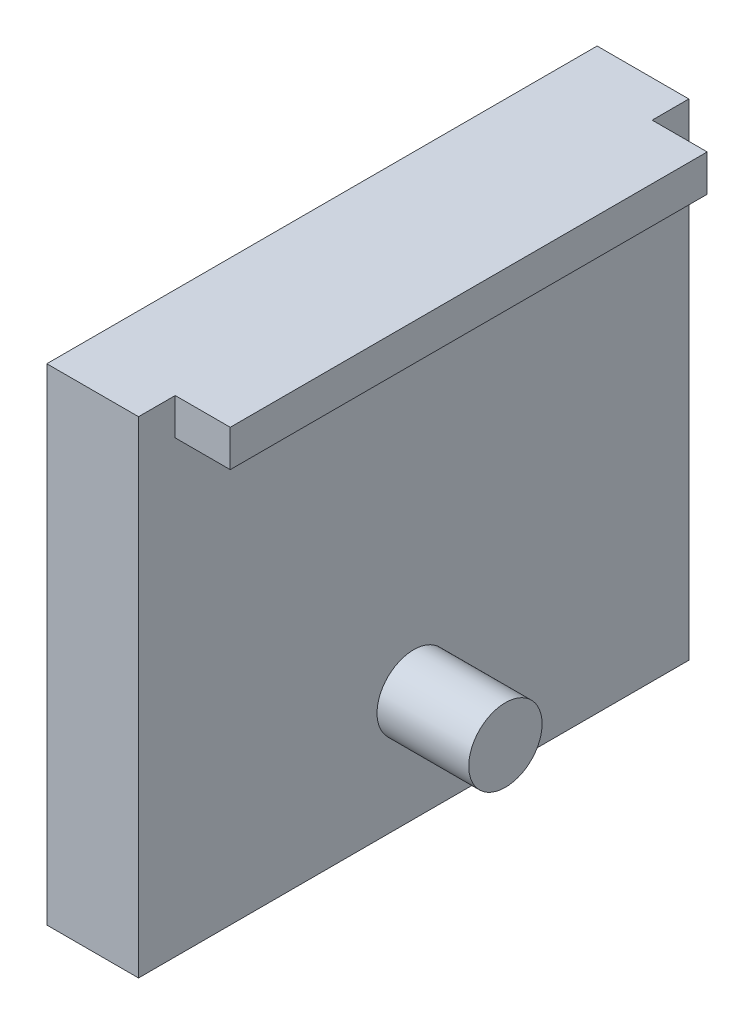
ISO-10303-21;
HEADER;
FILE_DESCRIPTION(('STEP AP214'),'2;1');
FILE_NAME('part.step','',(''),(''),'','','');
FILE_SCHEMA(('AUTOMOTIVE_DESIGN { 1 0 10303 214 1 1 1 1 }'));
ENDSEC;
DATA;
#1=APPLICATION_CONTEXT('core data for automotive mechanical design processes');
#2=APPLICATION_PROTOCOL_DEFINITION('international standard','automotive_design',2000,#1);
#3=PRODUCT_CONTEXT('',#1,'mechanical');
#4=PRODUCT('Part','Part','',(#3));
#5=PRODUCT_RELATED_PRODUCT_CATEGORY('part','',(#4));
#6=PRODUCT_DEFINITION_FORMATION('','',#4);
#7=PRODUCT_DEFINITION_CONTEXT('part definition',#1,'design');
#8=PRODUCT_DEFINITION('design','',#6,#7);
#9=PRODUCT_DEFINITION_SHAPE('','',#8);
#10=(LENGTH_UNIT() NAMED_UNIT(*) SI_UNIT(.MILLI.,.METRE.));
#11=(NAMED_UNIT(*) PLANE_ANGLE_UNIT() SI_UNIT($,.RADIAN.));
#12=(NAMED_UNIT(*) SI_UNIT($,.STERADIAN.) SOLID_ANGLE_UNIT());
#13=UNCERTAINTY_MEASURE_WITH_UNIT(LENGTH_MEASURE(1.E-05),#10,'distance_accuracy_value','');
#14=(GEOMETRIC_REPRESENTATION_CONTEXT(3) GLOBAL_UNCERTAINTY_ASSIGNED_CONTEXT((#13)) GLOBAL_UNIT_ASSIGNED_CONTEXT((#10,
#11,#12)) REPRESENTATION_CONTEXT('',''));
#15=CARTESIAN_POINT('',(0.,0.,0.));
#16=DIRECTION('',(0.,0.,1.));
#17=DIRECTION('',(1.,0.,0.));
#18=AXIS2_PLACEMENT_3D('',#15,#16,#17);
#19=CARTESIAN_POINT('',(-181.650792305083,0.,0.));
#20=DIRECTION('',(1.,0.,0.));
#21=DIRECTION('',(0.,0.,-1.));
#22=AXIS2_PLACEMENT_3D('',#19,#20,#21);
#23=PLANE('',#22);
#24=DIRECTION('',(0.,0.,1.));
#25=VECTOR('',#24,1.);
#26=CARTESIAN_POINT('',(-181.650792305083,40.,0.));
#27=LINE('',#26,#25);
#28=CARTESIAN_POINT('',(-181.650792305083,40.,138.));
#29=VERTEX_POINT('',#28);
#30=CARTESIAN_POINT('',(-181.650792305083,40.,160.));
#31=VERTEX_POINT('',#30);
#32=EDGE_CURVE('E255',#29,#31,#27,.T.);
#33=ORIENTED_EDGE('',*,*,#32,.F.);
#34=DIRECTION('',(0.,-1.,0.));
#35=VECTOR('',#34,1.);
#36=CARTESIAN_POINT('',(-181.650792305083,0.,138.));
#37=LINE('',#36,#35);
#38=CARTESIAN_POINT('',(-181.650792305083,42.,138.));
#39=VERTEX_POINT('',#38);
#40=EDGE_CURVE('E252',#39,#29,#37,.T.);
#41=ORIENTED_EDGE('',*,*,#40,.F.);
#42=DIRECTION('',(0.,0.,-1.));
#43=VECTOR('',#42,1.);
#44=CARTESIAN_POINT('',(-181.650792305083,42.,0.));
#45=LINE('',#44,#43);
#46=CARTESIAN_POINT('',(-181.650792305083,42.,160.));
#47=VERTEX_POINT('',#46);
#48=EDGE_CURVE('E249',#47,#39,#45,.T.);
#49=ORIENTED_EDGE('',*,*,#48,.F.);
#50=DIRECTION('',(0.,1.,0.));
#51=VECTOR('',#50,1.);
#52=CARTESIAN_POINT('',(-181.650792305083,0.,160.));
#53=LINE('',#52,#51);
#54=EDGE_CURVE('E246',#31,#47,#53,.T.);
#55=ORIENTED_EDGE('',*,*,#54,.F.);
#56=EDGE_LOOP('',(#33,#41,#49,#55));
#57=FACE_BOUND('',#56,.T.);
#58=DIRECTION('',(0.,0.,-1.));
#59=VECTOR('',#58,1.);
#60=CARTESIAN_POINT('',(-181.650792305083,37.,164.));
#61=LINE('',#60,#59);
#62=CARTESIAN_POINT('',(-181.650792305083,37.,164.));
#63=VERTEX_POINT('',#62);
#64=CARTESIAN_POINT('',(-181.650792305083,37.,134.));
#65=VERTEX_POINT('',#64);
#66=EDGE_CURVE('E215',#63,#65,#61,.T.);
#67=ORIENTED_EDGE('',*,*,#66,.F.);
#68=DIRECTION('',(0.,-1.,0.));
#69=VECTOR('',#68,1.);
#70=CARTESIAN_POINT('',(-181.650792305083,63.5,164.));
#71=LINE('',#70,#69);
#72=CARTESIAN_POINT('',(-181.650792305083,63.5,164.));
#73=VERTEX_POINT('',#72);
#74=EDGE_CURVE('E220',#73,#63,#71,.T.);
#75=ORIENTED_EDGE('',*,*,#74,.F.);
#76=DIRECTION('',(0.,0.,1.));
#77=VECTOR('',#76,1.);
#78=CARTESIAN_POINT('',(-181.650792305083,63.5,134.));
#79=LINE('',#78,#77);
#80=CARTESIAN_POINT('',(-181.650792305083,63.5,134.));
#81=VERTEX_POINT('',#80);
#82=EDGE_CURVE('E232',#81,#73,#79,.T.);
#83=ORIENTED_EDGE('',*,*,#82,.F.);
#84=DIRECTION('',(0.,1.,0.));
#85=VECTOR('',#84,1.);
#86=CARTESIAN_POINT('',(-181.650792305083,37.,134.));
#87=LINE('',#86,#85);
#88=EDGE_CURVE('E230',#65,#81,#87,.T.);
#89=ORIENTED_EDGE('',*,*,#88,.F.);
#90=EDGE_LOOP('',(#67,#75,#83,#89));
#91=FACE_BOUND('',#90,.T.);
#92=DIRECTION('',(0.,0.,1.));
#93=VECTOR('',#92,1.);
#94=CARTESIAN_POINT('',(-181.650792305083,44.,0.));
#95=LINE('',#94,#93);
#96=CARTESIAN_POINT('',(-181.650792305083,44.,138.));
#97=VERTEX_POINT('',#96);
#98=CARTESIAN_POINT('',(-181.650792305083,44.,160.));
#99=VERTEX_POINT('',#98);
#100=EDGE_CURVE('E11',#97,#99,#95,.T.);
#101=ORIENTED_EDGE('',*,*,#100,.F.);
#102=DIRECTION('',(0.,-1.,0.));
#103=VECTOR('',#102,1.);
#104=CARTESIAN_POINT('',(-181.650792305083,0.,138.));
#105=LINE('',#104,#103);
#106=CARTESIAN_POINT('',(-181.650792305083,46.,138.));
#107=VERTEX_POINT('',#106);
#108=EDGE_CURVE('E45',#107,#97,#105,.T.);
#109=ORIENTED_EDGE('',*,*,#108,.F.);
#110=DIRECTION('',(0.,0.,-1.));
#111=VECTOR('',#110,1.);
#112=CARTESIAN_POINT('',(-181.650792305083,46.,0.));
#113=LINE('',#112,#111);
#114=CARTESIAN_POINT('',(-181.650792305083,46.,160.));
#115=VERTEX_POINT('',#114);
#116=EDGE_CURVE('E261',#115,#107,#113,.T.);
#117=ORIENTED_EDGE('',*,*,#116,.F.);
#118=DIRECTION('',(0.,1.,0.));
#119=VECTOR('',#118,1.);
#120=CARTESIAN_POINT('',(-181.650792305083,0.,160.));
#121=LINE('',#120,#119);
#122=EDGE_CURVE('E258',#99,#115,#121,.T.);
#123=ORIENTED_EDGE('',*,*,#122,.F.);
#124=EDGE_LOOP('',(#101,#109,#117,#123));
#125=FACE_BOUND('',#124,.T.);
#126=ADVANCED_FACE('F37',(#57,#91,#125),#23,.F.);
#127=CARTESIAN_POINT('',(-176.650792305083,37.,164.));
#128=DIRECTION('',(0.,1.,0.));
#129=DIRECTION('',(0.,0.,1.));
#130=AXIS2_PLACEMENT_3D('',#127,#128,#129);
#131=PLANE('',#130);
#132=ORIENTED_EDGE('',*,*,#66,.T.);
#133=DIRECTION('',(-1.,0.,0.));
#134=VECTOR('',#133,1.);
#135=CARTESIAN_POINT('',(-176.650792305083,37.,134.));
#136=LINE('',#135,#134);
#137=CARTESIAN_POINT('',(-176.650792305083,37.,134.));
#138=VERTEX_POINT('',#137);
#139=EDGE_CURVE('E243',#138,#65,#136,.T.);
#140=ORIENTED_EDGE('',*,*,#139,.F.);
#141=DIRECTION('',(0.,0.,-1.));
#142=VECTOR('',#141,1.);
#143=CARTESIAN_POINT('',(-176.650792305083,37.,164.));
#144=LINE('',#143,#142);
#145=CARTESIAN_POINT('',(-176.650792305083,37.,164.));
#146=VERTEX_POINT('',#145);
#147=EDGE_CURVE('E216',#146,#138,#144,.T.);
#148=ORIENTED_EDGE('',*,*,#147,.F.);
#149=DIRECTION('',(-1.,0.,0.));
#150=VECTOR('',#149,1.);
#151=CARTESIAN_POINT('',(-176.650792305083,37.,164.));
#152=LINE('',#151,#150);
#153=EDGE_CURVE('E227',#146,#63,#152,.T.);
#154=ORIENTED_EDGE('',*,*,#153,.T.);
#155=EDGE_LOOP('',(#132,#140,#148,#154));
#156=FACE_BOUND('',#155,.T.);
#157=ADVANCED_FACE('F39',(#156),#131,.F.);
#158=CARTESIAN_POINT('',(-176.650792305083,37.,134.));
#159=DIRECTION('',(0.,0.,1.));
#160=DIRECTION('',(1.,0.,0.));
#161=AXIS2_PLACEMENT_3D('',#158,#159,#160);
#162=PLANE('',#161);
#163=ORIENTED_EDGE('',*,*,#88,.T.);
#164=DIRECTION('',(-1.,0.,0.));
#165=VECTOR('',#164,1.);
#166=CARTESIAN_POINT('',(-176.650792305083,63.5,134.));
#167=LINE('',#166,#165);
#168=CARTESIAN_POINT('',(-176.650792305083,63.5,134.));
#169=VERTEX_POINT('',#168);
#170=EDGE_CURVE('E240',#169,#81,#167,.T.);
#171=ORIENTED_EDGE('',*,*,#170,.F.);
#172=DIRECTION('',(0.,1.,0.));
#173=VECTOR('',#172,1.);
#174=CARTESIAN_POINT('',(-176.650792305083,37.,134.));
#175=LINE('',#174,#173);
#176=EDGE_CURVE('E219',#138,#169,#175,.T.);
#177=ORIENTED_EDGE('',*,*,#176,.F.);
#178=ORIENTED_EDGE('',*,*,#139,.T.);
#179=EDGE_LOOP('',(#163,#171,#177,#178));
#180=FACE_BOUND('',#179,.T.);
#181=ADVANCED_FACE('F297',(#180),#162,.F.);
#182=CARTESIAN_POINT('',(-176.650792305083,63.5,134.));
#183=DIRECTION('',(0.,-1.,0.));
#184=DIRECTION('',(0.,0.,-1.));
#185=AXIS2_PLACEMENT_3D('',#182,#183,#184);
#186=PLANE('',#185);
#187=ORIENTED_EDGE('',*,*,#82,.T.);
#188=DIRECTION('',(-1.,0.,0.));
#189=VECTOR('',#188,1.);
#190=CARTESIAN_POINT('',(-176.650792305083,63.5,164.));
#191=LINE('',#190,#189);
#192=CARTESIAN_POINT('',(-176.650792305083,63.5,164.));
#193=VERTEX_POINT('',#192);
#194=EDGE_CURVE('E237',#193,#73,#191,.T.);
#195=ORIENTED_EDGE('',*,*,#194,.F.);
#196=DIRECTION('',(0.,0.,1.));
#197=VECTOR('',#196,1.);
#198=CARTESIAN_POINT('',(-176.650792305083,63.5,134.));
#199=LINE('',#198,#197);
#200=CARTESIAN_POINT('',(-176.650792305083,63.5,162.));
#201=VERTEX_POINT('',#200);
#202=EDGE_CURVE('E222',#201,#193,#199,.T.);
#203=ORIENTED_EDGE('',*,*,#202,.F.);
#204=DIRECTION('',(-1.,0.,0.));
#205=VECTOR('',#204,1.);
#206=CARTESIAN_POINT('',(-173.650792305083,63.5,162.));
#207=LINE('',#206,#205);
#208=CARTESIAN_POINT('',(-173.650792305083,63.5,162.));
#209=VERTEX_POINT('',#208);
#210=EDGE_CURVE('E174',#209,#201,#207,.T.);
#211=ORIENTED_EDGE('',*,*,#210,.F.);
#212=DIRECTION('',(0.,0.,1.));
#213=VECTOR('',#212,1.);
#214=CARTESIAN_POINT('',(-173.650792305083,63.5,136.));
#215=LINE('',#214,#213);
#216=CARTESIAN_POINT('',(-173.650792305083,63.5,136.));
#217=VERTEX_POINT('',#216);
#218=EDGE_CURVE('E157',#217,#209,#215,.T.);
#219=ORIENTED_EDGE('',*,*,#218,.F.);
#220=DIRECTION('',(-1.,0.,0.));
#221=VECTOR('',#220,1.);
#222=CARTESIAN_POINT('',(-173.650792305083,63.5,136.));
#223=LINE('',#222,#221);
#224=CARTESIAN_POINT('',(-176.650792305083,63.5,136.));
#225=VERTEX_POINT('',#224);
#226=EDGE_CURVE('E154',#217,#225,#223,.T.);
#227=ORIENTED_EDGE('',*,*,#226,.T.);
#228=EDGE_CURVE('E223',#169,#225,#199,.T.);
#229=ORIENTED_EDGE('',*,*,#228,.F.);
#230=ORIENTED_EDGE('',*,*,#170,.T.);
#231=EDGE_LOOP('',(#187,#195,#203,#211,#219,#227,#229,#230));
#232=FACE_BOUND('',#231,.T.);
#233=ADVANCED_FACE('F307',(#232),#186,.F.);
#234=CARTESIAN_POINT('',(-176.650792305083,63.5,164.));
#235=DIRECTION('',(0.,0.,-1.));
#236=DIRECTION('',(-1.,0.,0.));
#237=AXIS2_PLACEMENT_3D('',#234,#235,#236);
#238=PLANE('',#237);
#239=ORIENTED_EDGE('',*,*,#74,.T.);
#240=ORIENTED_EDGE('',*,*,#153,.F.);
#241=DIRECTION('',(0.,-1.,0.));
#242=VECTOR('',#241,1.);
#243=CARTESIAN_POINT('',(-176.650792305083,63.5,164.));
#244=LINE('',#243,#242);
#245=EDGE_CURVE('E225',#193,#146,#244,.T.);
#246=ORIENTED_EDGE('',*,*,#245,.F.);
#247=ORIENTED_EDGE('',*,*,#194,.T.);
#248=EDGE_LOOP('',(#239,#240,#246,#247));
#249=FACE_BOUND('',#248,.T.);
#250=ADVANCED_FACE('F304',(#249),#238,.F.);
#251=CARTESIAN_POINT('',(-176.650792305083,0.,0.));
#252=DIRECTION('',(1.,0.,0.));
#253=DIRECTION('',(0.,0.,-1.));
#254=AXIS2_PLACEMENT_3D('',#251,#252,#253);
#255=PLANE('',#254);
#256=CARTESIAN_POINT('',(-176.650792305083,43.,149.));
#257=DIRECTION('',(1.,0.,0.));
#258=DIRECTION('',(0.,0.,-1.));
#259=AXIS2_PLACEMENT_3D('',#256,#257,#258);
#260=CIRCLE('',#259,2.);
#261=CARTESIAN_POINT('',(-176.650792305083,43.,147.));
#262=VERTEX_POINT('',#261);
#263=EDGE_CURVE('E339',#262,#262,#260,.T.);
#264=ORIENTED_EDGE('',*,*,#263,.F.);
#265=EDGE_LOOP('',(#264));
#266=FACE_BOUND('',#265,.T.);
#267=DIRECTION('',(0.,-1.,0.));
#268=VECTOR('',#267,1.);
#269=CARTESIAN_POINT('',(-176.650792305083,63.5,162.));
#270=LINE('',#269,#268);
#271=CARTESIAN_POINT('',(-176.650792305083,61.5,162.));
#272=VERTEX_POINT('',#271);
#273=EDGE_CURVE('E167',#201,#272,#270,.T.);
#274=ORIENTED_EDGE('',*,*,#273,.F.);
#275=ORIENTED_EDGE('',*,*,#202,.T.);
#276=ORIENTED_EDGE('',*,*,#245,.T.);
#277=ORIENTED_EDGE('',*,*,#147,.T.);
#278=ORIENTED_EDGE('',*,*,#176,.T.);
#279=ORIENTED_EDGE('',*,*,#228,.T.);
#280=DIRECTION('',(0.,1.,0.));
#281=VECTOR('',#280,1.);
#282=CARTESIAN_POINT('',(-176.650792305083,61.5,136.));
#283=LINE('',#282,#281);
#284=CARTESIAN_POINT('',(-176.650792305083,61.5,136.));
#285=VERTEX_POINT('',#284);
#286=EDGE_CURVE('E57',#285,#225,#283,.T.);
#287=ORIENTED_EDGE('',*,*,#286,.F.);
#288=DIRECTION('',(0.,0.,-1.));
#289=VECTOR('',#288,1.);
#290=CARTESIAN_POINT('',(-176.650792305083,61.5,162.));
#291=LINE('',#290,#289);
#292=EDGE_CURVE('E52',#272,#285,#291,.T.);
#293=ORIENTED_EDGE('',*,*,#292,.F.);
#294=EDGE_LOOP('',(#274,#275,#276,#277,#278,#279,#287,#293));
#295=FACE_BOUND('',#294,.T.);
#296=ADVANCED_FACE('F302',(#266,#295),#255,.T.);
#297=CARTESIAN_POINT('',(-181.150792305083,40.,160.));
#298=DIRECTION('',(0.,1.,0.));
#299=DIRECTION('',(0.,0.,1.));
#300=AXIS2_PLACEMENT_3D('',#297,#298,#299);
#301=PLANE('',#300);
#302=DIRECTION('',(-1.,0.,0.));
#303=VECTOR('',#302,1.);
#304=CARTESIAN_POINT('',(-181.150792305083,40.,138.));
#305=LINE('',#304,#303);
#306=CARTESIAN_POINT('',(-182.150792305083,40.,138.));
#307=VERTEX_POINT('',#306);
#308=EDGE_CURVE('E213',#29,#307,#305,.T.);
#309=ORIENTED_EDGE('',*,*,#308,.F.);
#310=ORIENTED_EDGE('',*,*,#32,.T.);
#311=DIRECTION('',(-1.,0.,0.));
#312=VECTOR('',#311,1.);
#313=CARTESIAN_POINT('',(-181.150792305083,40.,160.));
#314=LINE('',#313,#312);
#315=CARTESIAN_POINT('',(-182.150792305083,40.,160.));
#316=VERTEX_POINT('',#315);
#317=EDGE_CURVE('E207',#31,#316,#314,.T.);
#318=ORIENTED_EDGE('',*,*,#317,.T.);
#319=DIRECTION('',(0.,0.,-1.));
#320=VECTOR('',#319,1.);
#321=CARTESIAN_POINT('',(-182.150792305083,40.,160.));
#322=LINE('',#321,#320);
#323=EDGE_CURVE('E195',#316,#307,#322,.T.);
#324=ORIENTED_EDGE('',*,*,#323,.T.);
#325=EDGE_LOOP('',(#309,#310,#318,#324));
#326=FACE_BOUND('',#325,.T.);
#327=ADVANCED_FACE('F354',(#326),#301,.F.);
#328=CARTESIAN_POINT('',(-181.150792305083,40.,138.));
#329=DIRECTION('',(0.,0.,1.));
#330=DIRECTION('',(1.,0.,0.));
#331=AXIS2_PLACEMENT_3D('',#328,#329,#330);
#332=PLANE('',#331);
#333=DIRECTION('',(-1.,0.,0.));
#334=VECTOR('',#333,1.);
#335=CARTESIAN_POINT('',(-181.150792305083,42.,138.));
#336=LINE('',#335,#334);
#337=CARTESIAN_POINT('',(-182.150792305083,42.,138.));
#338=VERTEX_POINT('',#337);
#339=EDGE_CURVE('E211',#39,#338,#336,.T.);
#340=ORIENTED_EDGE('',*,*,#339,.F.);
#341=ORIENTED_EDGE('',*,*,#40,.T.);
#342=ORIENTED_EDGE('',*,*,#308,.T.);
#343=DIRECTION('',(0.,1.,0.));
#344=VECTOR('',#343,1.);
#345=CARTESIAN_POINT('',(-182.150792305083,40.,138.));
#346=LINE('',#345,#344);
#347=EDGE_CURVE('E198',#307,#338,#346,.T.);
#348=ORIENTED_EDGE('',*,*,#347,.T.);
#349=EDGE_LOOP('',(#340,#341,#342,#348));
#350=FACE_BOUND('',#349,.T.);
#351=ADVANCED_FACE('F358',(#350),#332,.F.);
#352=CARTESIAN_POINT('',(-181.150792305083,42.,138.));
#353=DIRECTION('',(0.,-1.,0.));
#354=DIRECTION('',(0.,0.,-1.));
#355=AXIS2_PLACEMENT_3D('',#352,#353,#354);
#356=PLANE('',#355);
#357=DIRECTION('',(-1.,0.,0.));
#358=VECTOR('',#357,1.);
#359=CARTESIAN_POINT('',(-181.150792305083,42.,160.));
#360=LINE('',#359,#358);
#361=CARTESIAN_POINT('',(-182.150792305083,42.,160.));
#362=VERTEX_POINT('',#361);
#363=EDGE_CURVE('E209',#47,#362,#360,.T.);
#364=ORIENTED_EDGE('',*,*,#363,.F.);
#365=ORIENTED_EDGE('',*,*,#48,.T.);
#366=ORIENTED_EDGE('',*,*,#339,.T.);
#367=DIRECTION('',(0.,0.,1.));
#368=VECTOR('',#367,1.);
#369=CARTESIAN_POINT('',(-182.150792305083,42.,138.));
#370=LINE('',#369,#368);
#371=EDGE_CURVE('E201',#338,#362,#370,.T.);
#372=ORIENTED_EDGE('',*,*,#371,.T.);
#373=EDGE_LOOP('',(#364,#365,#366,#372));
#374=FACE_BOUND('',#373,.T.);
#375=ADVANCED_FACE('F363',(#374),#356,.F.);
#376=CARTESIAN_POINT('',(-181.150792305083,42.,160.));
#377=DIRECTION('',(0.,0.,-1.));
#378=DIRECTION('',(-1.,0.,0.));
#379=AXIS2_PLACEMENT_3D('',#376,#377,#378);
#380=PLANE('',#379);
#381=ORIENTED_EDGE('',*,*,#317,.F.);
#382=ORIENTED_EDGE('',*,*,#54,.T.);
#383=ORIENTED_EDGE('',*,*,#363,.T.);
#384=DIRECTION('',(0.,-1.,0.));
#385=VECTOR('',#384,1.);
#386=CARTESIAN_POINT('',(-182.150792305083,42.,160.));
#387=LINE('',#386,#385);
#388=EDGE_CURVE('E204',#362,#316,#387,.T.);
#389=ORIENTED_EDGE('',*,*,#388,.T.);
#390=EDGE_LOOP('',(#381,#382,#383,#389));
#391=FACE_BOUND('',#390,.T.);
#392=ADVANCED_FACE('F370',(#391),#380,.F.);
#393=CARTESIAN_POINT('',(-182.150792305083,0.,0.));
#394=DIRECTION('',(1.,0.,0.));
#395=DIRECTION('',(0.,0.,-1.));
#396=AXIS2_PLACEMENT_3D('',#393,#394,#395);
#397=PLANE('',#396);
#398=ORIENTED_EDGE('',*,*,#323,.F.);
#399=ORIENTED_EDGE('',*,*,#388,.F.);
#400=ORIENTED_EDGE('',*,*,#371,.F.);
#401=ORIENTED_EDGE('',*,*,#347,.F.);
#402=EDGE_LOOP('',(#398,#399,#400,#401));
#403=FACE_BOUND('',#402,.T.);
#404=ADVANCED_FACE('F374',(#403),#397,.F.);
#405=CARTESIAN_POINT('',(-181.150792305083,44.,160.));
#406=DIRECTION('',(0.,1.,0.));
#407=DIRECTION('',(0.,0.,1.));
#408=AXIS2_PLACEMENT_3D('',#405,#406,#407);
#409=PLANE('',#408);
#410=DIRECTION('',(-1.,0.,0.));
#411=VECTOR('',#410,1.);
#412=CARTESIAN_POINT('',(-181.150792305083,44.,138.));
#413=LINE('',#412,#411);
#414=CARTESIAN_POINT('',(-182.150792305083,44.,138.));
#415=VERTEX_POINT('',#414);
#416=EDGE_CURVE('E170',#97,#415,#413,.T.);
#417=ORIENTED_EDGE('',*,*,#416,.F.);
#418=ORIENTED_EDGE('',*,*,#100,.T.);
#419=DIRECTION('',(-1.,0.,0.));
#420=VECTOR('',#419,1.);
#421=CARTESIAN_POINT('',(-181.150792305083,44.,160.));
#422=LINE('',#421,#420);
#423=CARTESIAN_POINT('',(-182.150792305083,44.,160.));
#424=VERTEX_POINT('',#423);
#425=EDGE_CURVE('E181',#99,#424,#422,.T.);
#426=ORIENTED_EDGE('',*,*,#425,.T.);
#427=DIRECTION('',(0.,0.,-1.));
#428=VECTOR('',#427,1.);
#429=CARTESIAN_POINT('',(-182.150792305083,44.,160.));
#430=LINE('',#429,#428);
#431=EDGE_CURVE('E192',#424,#415,#430,.T.);
#432=ORIENTED_EDGE('',*,*,#431,.T.);
#433=EDGE_LOOP('',(#417,#418,#426,#432));
#434=FACE_BOUND('',#433,.T.);
#435=ADVANCED_FACE('F271',(#434),#409,.F.);
#436=CARTESIAN_POINT('',(-181.150792305083,44.,138.));
#437=DIRECTION('',(0.,0.,1.));
#438=DIRECTION('',(1.,0.,0.));
#439=AXIS2_PLACEMENT_3D('',#436,#437,#438);
#440=PLANE('',#439);
#441=DIRECTION('',(-1.,0.,0.));
#442=VECTOR('',#441,1.);
#443=CARTESIAN_POINT('',(-181.150792305083,46.,138.));
#444=LINE('',#443,#442);
#445=CARTESIAN_POINT('',(-182.150792305083,46.,138.));
#446=VERTEX_POINT('',#445);
#447=EDGE_CURVE('E172',#107,#446,#444,.T.);
#448=ORIENTED_EDGE('',*,*,#447,.F.);
#449=ORIENTED_EDGE('',*,*,#108,.T.);
#450=ORIENTED_EDGE('',*,*,#416,.T.);
#451=DIRECTION('',(0.,1.,0.));
#452=VECTOR('',#451,1.);
#453=CARTESIAN_POINT('',(-182.150792305083,44.,138.));
#454=LINE('',#453,#452);
#455=EDGE_CURVE('E189',#415,#446,#454,.T.);
#456=ORIENTED_EDGE('',*,*,#455,.T.);
#457=EDGE_LOOP('',(#448,#449,#450,#456));
#458=FACE_BOUND('',#457,.T.);
#459=ADVANCED_FACE('F267',(#458),#440,.F.);
#460=CARTESIAN_POINT('',(-181.150792305083,46.,138.));
#461=DIRECTION('',(0.,-1.,0.));
#462=DIRECTION('',(0.,0.,-1.));
#463=AXIS2_PLACEMENT_3D('',#460,#461,#462);
#464=PLANE('',#463);
#465=DIRECTION('',(-1.,0.,0.));
#466=VECTOR('',#465,1.);
#467=CARTESIAN_POINT('',(-181.150792305083,46.,160.));
#468=LINE('',#467,#466);
#469=CARTESIAN_POINT('',(-182.150792305083,46.,160.));
#470=VERTEX_POINT('',#469);
#471=EDGE_CURVE('E179',#115,#470,#468,.T.);
#472=ORIENTED_EDGE('',*,*,#471,.F.);
#473=ORIENTED_EDGE('',*,*,#116,.T.);
#474=ORIENTED_EDGE('',*,*,#447,.T.);
#475=DIRECTION('',(0.,0.,1.));
#476=VECTOR('',#475,1.);
#477=CARTESIAN_POINT('',(-182.150792305083,46.,138.));
#478=LINE('',#477,#476);
#479=EDGE_CURVE('E186',#446,#470,#478,.T.);
#480=ORIENTED_EDGE('',*,*,#479,.T.);
#481=EDGE_LOOP('',(#472,#473,#474,#480));
#482=FACE_BOUND('',#481,.T.);
#483=ADVANCED_FACE('F280',(#482),#464,.F.);
#484=CARTESIAN_POINT('',(-181.150792305083,46.,160.));
#485=DIRECTION('',(0.,0.,-1.));
#486=DIRECTION('',(-1.,0.,0.));
#487=AXIS2_PLACEMENT_3D('',#484,#485,#486);
#488=PLANE('',#487);
#489=ORIENTED_EDGE('',*,*,#425,.F.);
#490=ORIENTED_EDGE('',*,*,#122,.T.);
#491=ORIENTED_EDGE('',*,*,#471,.T.);
#492=DIRECTION('',(0.,-1.,0.));
#493=VECTOR('',#492,1.);
#494=CARTESIAN_POINT('',(-182.150792305083,46.,160.));
#495=LINE('',#494,#493);
#496=EDGE_CURVE('E183',#470,#424,#495,.T.);
#497=ORIENTED_EDGE('',*,*,#496,.T.);
#498=EDGE_LOOP('',(#489,#490,#491,#497));
#499=FACE_BOUND('',#498,.T.);
#500=ADVANCED_FACE('F282',(#499),#488,.F.);
#501=CARTESIAN_POINT('',(-182.150792305083,0.,0.));
#502=DIRECTION('',(1.,0.,0.));
#503=DIRECTION('',(0.,0.,-1.));
#504=AXIS2_PLACEMENT_3D('',#501,#502,#503);
#505=PLANE('',#504);
#506=ORIENTED_EDGE('',*,*,#431,.F.);
#507=ORIENTED_EDGE('',*,*,#496,.F.);
#508=ORIENTED_EDGE('',*,*,#479,.F.);
#509=ORIENTED_EDGE('',*,*,#455,.F.);
#510=EDGE_LOOP('',(#506,#507,#508,#509));
#511=FACE_BOUND('',#510,.T.);
#512=ADVANCED_FACE('F276',(#511),#505,.F.);
#513=CARTESIAN_POINT('',(-173.650792305083,61.5,162.));
#514=DIRECTION('',(0.,1.,0.));
#515=DIRECTION('',(0.,0.,1.));
#516=AXIS2_PLACEMENT_3D('',#513,#514,#515);
#517=PLANE('',#516);
#518=ORIENTED_EDGE('',*,*,#292,.T.);
#519=DIRECTION('',(-1.,0.,0.));
#520=VECTOR('',#519,1.);
#521=CARTESIAN_POINT('',(-173.650792305083,61.5,136.));
#522=LINE('',#521,#520);
#523=CARTESIAN_POINT('',(-173.650792305083,61.5,136.));
#524=VERTEX_POINT('',#523);
#525=EDGE_CURVE('E152',#524,#285,#522,.T.);
#526=ORIENTED_EDGE('',*,*,#525,.F.);
#527=DIRECTION('',(0.,0.,-1.));
#528=VECTOR('',#527,1.);
#529=CARTESIAN_POINT('',(-173.650792305083,61.5,162.));
#530=LINE('',#529,#528);
#531=CARTESIAN_POINT('',(-173.650792305083,61.5,162.));
#532=VERTEX_POINT('',#531);
#533=EDGE_CURVE('E158',#532,#524,#530,.T.);
#534=ORIENTED_EDGE('',*,*,#533,.F.);
#535=DIRECTION('',(-1.,0.,0.));
#536=VECTOR('',#535,1.);
#537=CARTESIAN_POINT('',(-173.650792305083,61.5,162.));
#538=LINE('',#537,#536);
#539=EDGE_CURVE('E330',#532,#272,#538,.T.);
#540=ORIENTED_EDGE('',*,*,#539,.T.);
#541=EDGE_LOOP('',(#518,#526,#534,#540));
#542=FACE_BOUND('',#541,.T.);
#543=ADVANCED_FACE('F169',(#542),#517,.F.);
#544=CARTESIAN_POINT('',(-173.650792305083,61.5,136.));
#545=DIRECTION('',(0.,0.,1.));
#546=DIRECTION('',(1.,0.,0.));
#547=AXIS2_PLACEMENT_3D('',#544,#545,#546);
#548=PLANE('',#547);
#549=ORIENTED_EDGE('',*,*,#286,.T.);
#550=ORIENTED_EDGE('',*,*,#226,.F.);
#551=DIRECTION('',(0.,1.,0.));
#552=VECTOR('',#551,1.);
#553=CARTESIAN_POINT('',(-173.650792305083,61.5,136.));
#554=LINE('',#553,#552);
#555=EDGE_CURVE('E148',#524,#217,#554,.T.);
#556=ORIENTED_EDGE('',*,*,#555,.F.);
#557=ORIENTED_EDGE('',*,*,#525,.T.);
#558=EDGE_LOOP('',(#549,#550,#556,#557));
#559=FACE_BOUND('',#558,.T.);
#560=ADVANCED_FACE('F150',(#559),#548,.F.);
#561=CARTESIAN_POINT('',(-173.650792305083,63.5,162.));
#562=DIRECTION('',(0.,0.,-1.));
#563=DIRECTION('',(-1.,0.,0.));
#564=AXIS2_PLACEMENT_3D('',#561,#562,#563);
#565=PLANE('',#564);
#566=ORIENTED_EDGE('',*,*,#273,.T.);
#567=ORIENTED_EDGE('',*,*,#539,.F.);
#568=DIRECTION('',(0.,-1.,0.));
#569=VECTOR('',#568,1.);
#570=CARTESIAN_POINT('',(-173.650792305083,63.5,162.));
#571=LINE('',#570,#569);
#572=EDGE_CURVE('E163',#209,#532,#571,.T.);
#573=ORIENTED_EDGE('',*,*,#572,.F.);
#574=ORIENTED_EDGE('',*,*,#210,.T.);
#575=EDGE_LOOP('',(#566,#567,#573,#574));
#576=FACE_BOUND('',#575,.T.);
#577=ADVANCED_FACE('F329',(#576),#565,.F.);
#578=CARTESIAN_POINT('',(-173.650792305083,0.,0.));
#579=DIRECTION('',(1.,0.,0.));
#580=DIRECTION('',(0.,0.,-1.));
#581=AXIS2_PLACEMENT_3D('',#578,#579,#580);
#582=PLANE('',#581);
#583=ORIENTED_EDGE('',*,*,#533,.T.);
#584=ORIENTED_EDGE('',*,*,#555,.T.);
#585=ORIENTED_EDGE('',*,*,#218,.T.);
#586=ORIENTED_EDGE('',*,*,#572,.T.);
#587=EDGE_LOOP('',(#583,#584,#585,#586));
#588=FACE_BOUND('',#587,.T.);
#589=ADVANCED_FACE('F161',(#588),#582,.T.);
#590=CARTESIAN_POINT('',(-171.650792305083,43.,149.));
#591=DIRECTION('',(-1.,0.,0.));
#592=DIRECTION('',(0.,0.,1.));
#593=AXIS2_PLACEMENT_3D('',#590,#591,#592);
#594=CYLINDRICAL_SURFACE('',#593,2.);
#595=CARTESIAN_POINT('',(-171.650792305083,43.,149.));
#596=DIRECTION('',(1.,0.,0.));
#597=DIRECTION('',(0.,0.,-1.));
#598=AXIS2_PLACEMENT_3D('',#595,#596,#597);
#599=CIRCLE('',#598,2.);
#600=CARTESIAN_POINT('',(-171.650792305083,43.,147.));
#601=VERTEX_POINT('',#600);
#602=EDGE_CURVE('E336',#601,#601,#599,.T.);
#603=ORIENTED_EDGE('',*,*,#602,.F.);
#604=EDGE_LOOP('',(#603));
#605=FACE_BOUND('',#604,.T.);
#606=ORIENTED_EDGE('',*,*,#263,.T.);
#607=EDGE_LOOP('',(#606));
#608=FACE_BOUND('',#607,.T.);
#609=ADVANCED_FACE('F347',(#605,#608),#594,.T.);
#610=CARTESIAN_POINT('',(-171.650792305083,43.,149.));
#611=DIRECTION('',(1.,0.,0.));
#612=DIRECTION('',(0.,0.,-1.));
#613=AXIS2_PLACEMENT_3D('',#610,#611,#612);
#614=PLANE('',#613);
#615=ORIENTED_EDGE('',*,*,#602,.T.);
#616=EDGE_LOOP('',(#615));
#617=FACE_BOUND('',#616,.T.);
#618=ADVANCED_FACE('F345',(#617),#614,.T.);
#619=CLOSED_SHELL('',(#126,#157,#181,#233,#250,#296,#327,#351,#375,#392,#404,#435,#459,#483,
#500,#512,#543,#560,#577,#589,#609,#618));
#620=MANIFOLD_SOLID_BREP('B2',#619);
#621=ADVANCED_BREP_SHAPE_REPRESENTATION('',(#18,#620),#14);
#622=SHAPE_DEFINITION_REPRESENTATION(#9,#621);
ENDSEC;
END-ISO-10303-21;
